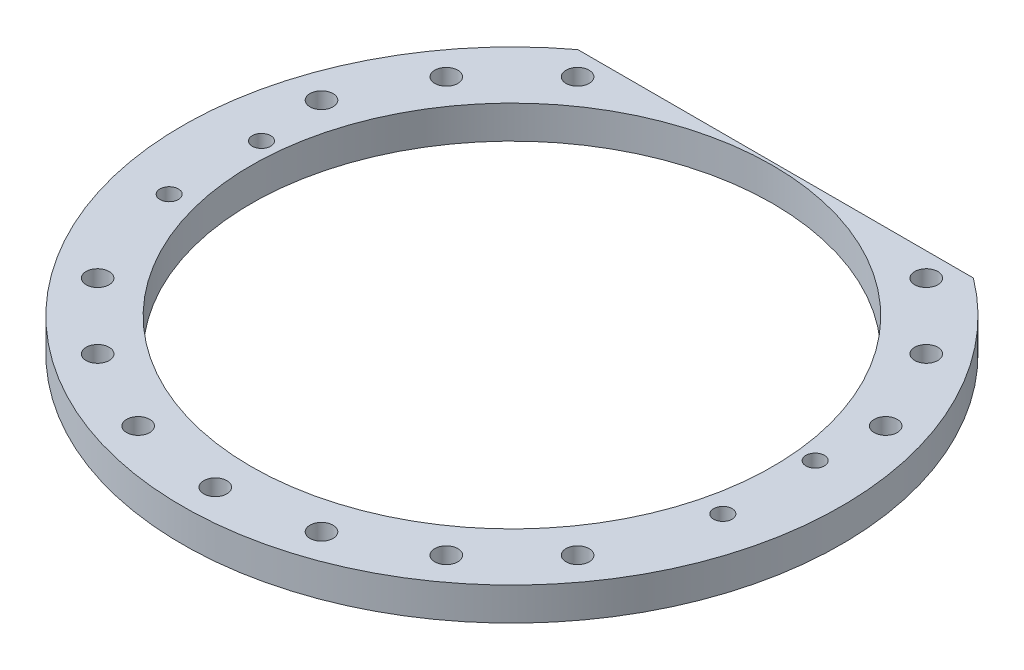
ISO-10303-21;
HEADER;
FILE_DESCRIPTION(('STEP AP214'),'2;1');
FILE_NAME('part.step','',(''),(''),'','','');
FILE_SCHEMA(('AUTOMOTIVE_DESIGN { 1 0 10303 214 1 1 1 1 }'));
ENDSEC;
DATA;
#1=APPLICATION_CONTEXT('core data for automotive mechanical design processes');
#2=APPLICATION_PROTOCOL_DEFINITION('international standard','automotive_design',2000,#1);
#3=PRODUCT_CONTEXT('',#1,'mechanical');
#4=PRODUCT('Part','Part','',(#3));
#5=PRODUCT_RELATED_PRODUCT_CATEGORY('part','',(#4));
#6=PRODUCT_DEFINITION_FORMATION('','',#4);
#7=PRODUCT_DEFINITION_CONTEXT('part definition',#1,'design');
#8=PRODUCT_DEFINITION('design','',#6,#7);
#9=PRODUCT_DEFINITION_SHAPE('','',#8);
#10=(LENGTH_UNIT() NAMED_UNIT(*) SI_UNIT(.MILLI.,.METRE.));
#11=(NAMED_UNIT(*) PLANE_ANGLE_UNIT() SI_UNIT($,.RADIAN.));
#12=(NAMED_UNIT(*) SI_UNIT($,.STERADIAN.) SOLID_ANGLE_UNIT());
#13=UNCERTAINTY_MEASURE_WITH_UNIT(LENGTH_MEASURE(1.E-05),#10,'distance_accuracy_value','');
#14=(GEOMETRIC_REPRESENTATION_CONTEXT(3) GLOBAL_UNCERTAINTY_ASSIGNED_CONTEXT((#13)) GLOBAL_UNIT_ASSIGNED_CONTEXT((#10,
#11,#12)) REPRESENTATION_CONTEXT('',''));
#15=CARTESIAN_POINT('',(0.,0.,0.));
#16=DIRECTION('',(0.,0.,1.));
#17=DIRECTION('',(1.,0.,0.));
#18=AXIS2_PLACEMENT_3D('',#15,#16,#17);
#19=CARTESIAN_POINT('',(0.,5.,0.));
#20=DIRECTION('',(0.,1.,0.));
#21=DIRECTION('',(0.,0.,1.));
#22=AXIS2_PLACEMENT_3D('',#19,#20,#21);
#23=PLANE('',#22);
#24=DIRECTION('',(1.,0.,0.));
#25=VECTOR('',#24,1.);
#26=CARTESIAN_POINT('',(0.,5.,-40.));
#27=LINE('',#26,#25);
#28=CARTESIAN_POINT('',(-30.,5.,-40.));
#29=VERTEX_POINT('',#28);
#30=CARTESIAN_POINT('',(30.,5.,-40.));
#31=VERTEX_POINT('',#30);
#32=EDGE_CURVE('E60',#29,#31,#27,.T.);
#33=ORIENTED_EDGE('',*,*,#32,.F.);
#34=CARTESIAN_POINT('',(0.,5.,0.));
#35=DIRECTION('',(0.,1.,0.));
#36=DIRECTION('',(0.,0.,1.));
#37=AXIS2_PLACEMENT_3D('',#34,#35,#36);
#38=CIRCLE('',#37,50.);
#39=EDGE_CURVE('E75',#29,#31,#38,.T.);
#40=ORIENTED_EDGE('',*,*,#39,.T.);
#41=EDGE_LOOP('',(#33,#40));
#42=FACE_BOUND('',#41,.T.);
#43=CARTESIAN_POINT('',(26.4503363531608,5.,36.405764746873));
#44=DIRECTION('',(0.,1.,0.));
#45=DIRECTION('',(0.,0.,1.));
#46=AXIS2_PLACEMENT_3D('',#43,#44,#45);
#47=CIRCLE('',#46,1.75);
#48=CARTESIAN_POINT('',(26.4503363531608,5.,38.155764746873));
#49=VERTEX_POINT('',#48);
#50=EDGE_CURVE('E213',#49,#49,#47,.T.);
#51=ORIENTED_EDGE('',*,*,#50,.F.);
#52=EDGE_LOOP('',(#51));
#53=FACE_BOUND('',#52,.T.);
#54=CARTESIAN_POINT('',(42.797543233282,5.,-13.9057647468722));
#55=DIRECTION('',(0.,1.,0.));
#56=DIRECTION('',(0.,0.,1.));
#57=AXIS2_PLACEMENT_3D('',#54,#55,#56);
#58=CIRCLE('',#57,1.74999999999999);
#59=CARTESIAN_POINT('',(42.797543233282,5.,-12.1557647468722));
#60=VERTEX_POINT('',#59);
#61=EDGE_CURVE('E197',#60,#60,#58,.T.);
#62=ORIENTED_EDGE('',*,*,#61,.F.);
#63=EDGE_LOOP('',(#62));
#64=FACE_BOUND('',#63,.T.);
#65=CARTESIAN_POINT('',(26.4503363531616,5.,-36.4057647468724));
#66=DIRECTION('',(0.,1.,0.));
#67=DIRECTION('',(0.,0.,1.));
#68=AXIS2_PLACEMENT_3D('',#65,#66,#67);
#69=CIRCLE('',#68,1.75);
#70=CARTESIAN_POINT('',(26.4503363531616,5.,-34.6557647468724));
#71=VERTEX_POINT('',#70);
#72=EDGE_CURVE('E181',#71,#71,#69,.T.);
#73=ORIENTED_EDGE('',*,*,#72,.F.);
#74=EDGE_LOOP('',(#73));
#75=FACE_BOUND('',#74,.T.);
#76=CARTESIAN_POINT('',(-36.4057647468725,5.,-26.4503363531615));
#77=DIRECTION('',(0.,1.,0.));
#78=DIRECTION('',(0.,0.,1.));
#79=AXIS2_PLACEMENT_3D('',#76,#77,#78);
#80=CIRCLE('',#79,1.75);
#81=CARTESIAN_POINT('',(-36.4057647468725,5.,-24.7003363531615));
#82=VERTEX_POINT('',#81);
#83=EDGE_CURVE('E165',#82,#82,#80,.T.);
#84=ORIENTED_EDGE('',*,*,#83,.F.);
#85=EDGE_LOOP('',(#84));
#86=FACE_BOUND('',#85,.T.);
#87=CARTESIAN_POINT('',(-36.4057647468727,5.,26.4503363531612));
#88=DIRECTION('',(0.,1.,0.));
#89=DIRECTION('',(0.,0.,1.));
#90=AXIS2_PLACEMENT_3D('',#87,#88,#89);
#91=CIRCLE('',#90,1.75);
#92=CARTESIAN_POINT('',(-36.4057647468727,5.,28.2003363531612));
#93=VERTEX_POINT('',#92);
#94=EDGE_CURVE('E149',#93,#93,#91,.T.);
#95=ORIENTED_EDGE('',*,*,#94,.F.);
#96=EDGE_LOOP('',(#95));
#97=FACE_BOUND('',#96,.T.);
#98=CARTESIAN_POINT('',(-13.9057647468727,5.,42.7975432332819));
#99=DIRECTION('',(0.,1.,0.));
#100=DIRECTION('',(0.,0.,1.));
#101=AXIS2_PLACEMENT_3D('',#98,#99,#100);
#102=CIRCLE('',#101,1.75);
#103=CARTESIAN_POINT('',(-13.9057647468727,5.,44.5475432332819));
#104=VERTEX_POINT('',#103);
#105=EDGE_CURVE('E133',#104,#104,#102,.T.);
#106=ORIENTED_EDGE('',*,*,#105,.F.);
#107=EDGE_LOOP('',(#106));
#108=FACE_BOUND('',#107,.T.);
#109=CARTESIAN_POINT('',(-42.,5.,-4.));
#110=DIRECTION('',(0.,1.,0.));
#111=DIRECTION('',(0.,0.,1.));
#112=AXIS2_PLACEMENT_3D('',#109,#110,#111);
#113=CIRCLE('',#112,1.4);
#114=CARTESIAN_POINT('',(-42.,5.,-2.6));
#115=VERTEX_POINT('',#114);
#116=EDGE_CURVE('E117',#115,#115,#113,.T.);
#117=ORIENTED_EDGE('',*,*,#116,.F.);
#118=EDGE_LOOP('',(#117));
#119=FACE_BOUND('',#118,.T.);
#120=CARTESIAN_POINT('',(42.,5.,-4.));
#121=DIRECTION('',(0.,1.,0.));
#122=DIRECTION('',(0.,0.,1.));
#123=AXIS2_PLACEMENT_3D('',#120,#121,#122);
#124=CIRCLE('',#123,1.4);
#125=CARTESIAN_POINT('',(42.,5.,-2.6));
#126=VERTEX_POINT('',#125);
#127=EDGE_CURVE('E101',#126,#126,#124,.T.);
#128=ORIENTED_EDGE('',*,*,#127,.F.);
#129=EDGE_LOOP('',(#128));
#130=FACE_BOUND('',#129,.T.);
#131=CARTESIAN_POINT('',(0.,5.,0.));
#132=DIRECTION('',(0.,1.,0.));
#133=DIRECTION('',(0.,0.,1.));
#134=AXIS2_PLACEMENT_3D('',#131,#132,#133);
#135=CIRCLE('',#134,39.565);
#136=CARTESIAN_POINT('',(0.,5.,39.565));
#137=VERTEX_POINT('',#136);
#138=EDGE_CURVE('E84',#137,#137,#135,.T.);
#139=ORIENTED_EDGE('',*,*,#138,.F.);
#140=EDGE_LOOP('',(#139));
#141=FACE_BOUND('',#140,.T.);
#142=CARTESIAN_POINT('',(42.,5.,10.));
#143=DIRECTION('',(0.,1.,0.));
#144=DIRECTION('',(0.,0.,1.));
#145=AXIS2_PLACEMENT_3D('',#142,#143,#144);
#146=CIRCLE('',#145,1.4);
#147=CARTESIAN_POINT('',(42.,5.,11.4));
#148=VERTEX_POINT('',#147);
#149=EDGE_CURVE('E95',#148,#148,#146,.T.);
#150=ORIENTED_EDGE('',*,*,#149,.F.);
#151=EDGE_LOOP('',(#150));
#152=FACE_BOUND('',#151,.T.);
#153=CARTESIAN_POINT('',(-42.,5.,10.));
#154=DIRECTION('',(0.,1.,0.));
#155=DIRECTION('',(0.,0.,1.));
#156=AXIS2_PLACEMENT_3D('',#153,#154,#155);
#157=CIRCLE('',#156,1.4);
#158=CARTESIAN_POINT('',(-42.,5.,11.4));
#159=VERTEX_POINT('',#158);
#160=EDGE_CURVE('E109',#159,#159,#157,.T.);
#161=ORIENTED_EDGE('',*,*,#160,.F.);
#162=EDGE_LOOP('',(#161));
#163=FACE_BOUND('',#162,.T.);
#164=CARTESIAN_POINT('',(0.,5.,45.));
#165=DIRECTION('',(0.,1.,0.));
#166=DIRECTION('',(0.,0.,1.));
#167=AXIS2_PLACEMENT_3D('',#164,#165,#166);
#168=CIRCLE('',#167,1.75);
#169=CARTESIAN_POINT('',(0.,5.,46.75));
#170=VERTEX_POINT('',#169);
#171=EDGE_CURVE('E125',#170,#170,#168,.T.);
#172=ORIENTED_EDGE('',*,*,#171,.F.);
#173=EDGE_LOOP('',(#172));
#174=FACE_BOUND('',#173,.T.);
#175=CARTESIAN_POINT('',(-26.4503363531613,5.,36.4057647468726));
#176=DIRECTION('',(0.,1.,0.));
#177=DIRECTION('',(0.,0.,1.));
#178=AXIS2_PLACEMENT_3D('',#175,#176,#177);
#179=CIRCLE('',#178,1.75);
#180=CARTESIAN_POINT('',(-26.4503363531613,5.,38.1557647468726));
#181=VERTEX_POINT('',#180);
#182=EDGE_CURVE('E141',#181,#181,#179,.T.);
#183=ORIENTED_EDGE('',*,*,#182,.F.);
#184=EDGE_LOOP('',(#183));
#185=FACE_BOUND('',#184,.T.);
#186=CARTESIAN_POINT('',(-42.7975432332819,5.,-13.9057647468728));
#187=DIRECTION('',(0.,1.,0.));
#188=DIRECTION('',(0.,0.,1.));
#189=AXIS2_PLACEMENT_3D('',#186,#187,#188);
#190=CIRCLE('',#189,1.75);
#191=CARTESIAN_POINT('',(-42.7975432332819,5.,-12.1557647468728));
#192=VERTEX_POINT('',#191);
#193=EDGE_CURVE('E157',#192,#192,#190,.T.);
#194=ORIENTED_EDGE('',*,*,#193,.F.);
#195=EDGE_LOOP('',(#194));
#196=FACE_BOUND('',#195,.T.);
#197=CARTESIAN_POINT('',(-26.4503363531611,5.,-36.4057647468728));
#198=DIRECTION('',(0.,1.,0.));
#199=DIRECTION('',(0.,0.,1.));
#200=AXIS2_PLACEMENT_3D('',#197,#198,#199);
#201=CIRCLE('',#200,1.75);
#202=CARTESIAN_POINT('',(-26.4503363531611,5.,-34.6557647468728));
#203=VERTEX_POINT('',#202);
#204=EDGE_CURVE('E173',#203,#203,#201,.T.);
#205=ORIENTED_EDGE('',*,*,#204,.F.);
#206=EDGE_LOOP('',(#205));
#207=FACE_BOUND('',#206,.T.);
#208=CARTESIAN_POINT('',(36.4057647468729,5.,-26.4503363531609));
#209=DIRECTION('',(0.,1.,0.));
#210=DIRECTION('',(0.,0.,1.));
#211=AXIS2_PLACEMENT_3D('',#208,#209,#210);
#212=CIRCLE('',#211,1.75);
#213=CARTESIAN_POINT('',(36.4057647468729,5.,-24.7003363531609));
#214=VERTEX_POINT('',#213);
#215=EDGE_CURVE('E189',#214,#214,#212,.T.);
#216=ORIENTED_EDGE('',*,*,#215,.F.);
#217=EDGE_LOOP('',(#216));
#218=FACE_BOUND('',#217,.T.);
#219=CARTESIAN_POINT('',(36.4057647468723,5.,26.4503363531617));
#220=DIRECTION('',(0.,1.,0.));
#221=DIRECTION('',(0.,0.,1.));
#222=AXIS2_PLACEMENT_3D('',#219,#220,#221);
#223=CIRCLE('',#222,1.75);
#224=CARTESIAN_POINT('',(36.4057647468723,5.,28.2003363531617));
#225=VERTEX_POINT('',#224);
#226=EDGE_CURVE('E205',#225,#225,#223,.T.);
#227=ORIENTED_EDGE('',*,*,#226,.F.);
#228=EDGE_LOOP('',(#227));
#229=FACE_BOUND('',#228,.T.);
#230=CARTESIAN_POINT('',(13.9057647468721,5.,42.7975432332821));
#231=DIRECTION('',(0.,1.,0.));
#232=DIRECTION('',(0.,0.,1.));
#233=AXIS2_PLACEMENT_3D('',#230,#231,#232);
#234=CIRCLE('',#233,1.75);
#235=CARTESIAN_POINT('',(13.9057647468721,5.,44.5475432332821));
#236=VERTEX_POINT('',#235);
#237=EDGE_CURVE('E221',#236,#236,#234,.T.);
#238=ORIENTED_EDGE('',*,*,#237,.F.);
#239=EDGE_LOOP('',(#238));
#240=FACE_BOUND('',#239,.T.);
#241=ADVANCED_FACE('F44',(#42,#53,#64,#75,#86,#97,#108,#119,#130,#141,#152,#163,#174,#185,#196,
#207,#218,#229,#240),#23,.T.);
#242=CARTESIAN_POINT('',(0.,0.,0.));
#243=DIRECTION('',(0.,1.,0.));
#244=DIRECTION('',(0.,0.,1.));
#245=AXIS2_PLACEMENT_3D('',#242,#243,#244);
#246=PLANE('',#245);
#247=CARTESIAN_POINT('',(0.,0.,0.));
#248=DIRECTION('',(0.,1.,0.));
#249=DIRECTION('',(0.,0.,1.));
#250=AXIS2_PLACEMENT_3D('',#247,#248,#249);
#251=CIRCLE('',#250,50.);
#252=CARTESIAN_POINT('',(-30.,0.,-40.));
#253=VERTEX_POINT('',#252);
#254=CARTESIAN_POINT('',(30.,0.,-40.));
#255=VERTEX_POINT('',#254);
#256=EDGE_CURVE('E80',#253,#255,#251,.T.);
#257=ORIENTED_EDGE('',*,*,#256,.F.);
#258=DIRECTION('',(1.,0.,0.));
#259=VECTOR('',#258,1.);
#260=CARTESIAN_POINT('',(0.,0.,-40.));
#261=LINE('',#260,#259);
#262=EDGE_CURVE('E69',#253,#255,#261,.T.);
#263=ORIENTED_EDGE('',*,*,#262,.T.);
#264=EDGE_LOOP('',(#257,#263));
#265=FACE_BOUND('',#264,.T.);
#266=CARTESIAN_POINT('',(0.,0.,0.));
#267=DIRECTION('',(0.,1.,0.));
#268=DIRECTION('',(0.,0.,1.));
#269=AXIS2_PLACEMENT_3D('',#266,#267,#268);
#270=CIRCLE('',#269,39.565);
#271=CARTESIAN_POINT('',(0.,0.,39.565));
#272=VERTEX_POINT('',#271);
#273=EDGE_CURVE('E90',#272,#272,#270,.T.);
#274=ORIENTED_EDGE('',*,*,#273,.T.);
#275=EDGE_LOOP('',(#274));
#276=FACE_BOUND('',#275,.T.);
#277=CARTESIAN_POINT('',(42.,0.,10.));
#278=DIRECTION('',(0.,1.,0.));
#279=DIRECTION('',(0.,0.,1.));
#280=AXIS2_PLACEMENT_3D('',#277,#278,#279);
#281=CIRCLE('',#280,1.4);
#282=CARTESIAN_POINT('',(42.,0.,11.4));
#283=VERTEX_POINT('',#282);
#284=EDGE_CURVE('E97',#283,#283,#281,.T.);
#285=ORIENTED_EDGE('',*,*,#284,.T.);
#286=EDGE_LOOP('',(#285));
#287=FACE_BOUND('',#286,.T.);
#288=CARTESIAN_POINT('',(42.,0.,-4.));
#289=DIRECTION('',(0.,1.,0.));
#290=DIRECTION('',(0.,0.,1.));
#291=AXIS2_PLACEMENT_3D('',#288,#289,#290);
#292=CIRCLE('',#291,1.4);
#293=CARTESIAN_POINT('',(42.,0.,-2.6));
#294=VERTEX_POINT('',#293);
#295=EDGE_CURVE('E105',#294,#294,#292,.T.);
#296=ORIENTED_EDGE('',*,*,#295,.T.);
#297=EDGE_LOOP('',(#296));
#298=FACE_BOUND('',#297,.T.);
#299=CARTESIAN_POINT('',(-42.,0.,10.));
#300=DIRECTION('',(0.,1.,0.));
#301=DIRECTION('',(0.,0.,1.));
#302=AXIS2_PLACEMENT_3D('',#299,#300,#301);
#303=CIRCLE('',#302,1.4);
#304=CARTESIAN_POINT('',(-42.,0.,11.4));
#305=VERTEX_POINT('',#304);
#306=EDGE_CURVE('E113',#305,#305,#303,.T.);
#307=ORIENTED_EDGE('',*,*,#306,.T.);
#308=EDGE_LOOP('',(#307));
#309=FACE_BOUND('',#308,.T.);
#310=CARTESIAN_POINT('',(-42.,0.,-4.));
#311=DIRECTION('',(0.,1.,0.));
#312=DIRECTION('',(0.,0.,1.));
#313=AXIS2_PLACEMENT_3D('',#310,#311,#312);
#314=CIRCLE('',#313,1.4);
#315=CARTESIAN_POINT('',(-42.,0.,-2.6));
#316=VERTEX_POINT('',#315);
#317=EDGE_CURVE('E121',#316,#316,#314,.T.);
#318=ORIENTED_EDGE('',*,*,#317,.T.);
#319=EDGE_LOOP('',(#318));
#320=FACE_BOUND('',#319,.T.);
#321=CARTESIAN_POINT('',(0.,0.,45.));
#322=DIRECTION('',(0.,1.,0.));
#323=DIRECTION('',(0.,0.,1.));
#324=AXIS2_PLACEMENT_3D('',#321,#322,#323);
#325=CIRCLE('',#324,1.75);
#326=CARTESIAN_POINT('',(0.,0.,46.75));
#327=VERTEX_POINT('',#326);
#328=EDGE_CURVE('E129',#327,#327,#325,.T.);
#329=ORIENTED_EDGE('',*,*,#328,.T.);
#330=EDGE_LOOP('',(#329));
#331=FACE_BOUND('',#330,.T.);
#332=CARTESIAN_POINT('',(-13.9057647468727,0.,42.7975432332819));
#333=DIRECTION('',(0.,1.,0.));
#334=DIRECTION('',(0.,0.,1.));
#335=AXIS2_PLACEMENT_3D('',#332,#333,#334);
#336=CIRCLE('',#335,1.75);
#337=CARTESIAN_POINT('',(-13.9057647468727,0.,44.5475432332819));
#338=VERTEX_POINT('',#337);
#339=EDGE_CURVE('E137',#338,#338,#336,.T.);
#340=ORIENTED_EDGE('',*,*,#339,.T.);
#341=EDGE_LOOP('',(#340));
#342=FACE_BOUND('',#341,.T.);
#343=CARTESIAN_POINT('',(-26.4503363531613,0.,36.4057647468726));
#344=DIRECTION('',(0.,1.,0.));
#345=DIRECTION('',(0.,0.,1.));
#346=AXIS2_PLACEMENT_3D('',#343,#344,#345);
#347=CIRCLE('',#346,1.75);
#348=CARTESIAN_POINT('',(-26.4503363531613,0.,38.1557647468726));
#349=VERTEX_POINT('',#348);
#350=EDGE_CURVE('E145',#349,#349,#347,.T.);
#351=ORIENTED_EDGE('',*,*,#350,.T.);
#352=EDGE_LOOP('',(#351));
#353=FACE_BOUND('',#352,.T.);
#354=CARTESIAN_POINT('',(-36.4057647468727,0.,26.4503363531612));
#355=DIRECTION('',(0.,1.,0.));
#356=DIRECTION('',(0.,0.,1.));
#357=AXIS2_PLACEMENT_3D('',#354,#355,#356);
#358=CIRCLE('',#357,1.75);
#359=CARTESIAN_POINT('',(-36.4057647468727,0.,28.2003363531612));
#360=VERTEX_POINT('',#359);
#361=EDGE_CURVE('E153',#360,#360,#358,.T.);
#362=ORIENTED_EDGE('',*,*,#361,.T.);
#363=EDGE_LOOP('',(#362));
#364=FACE_BOUND('',#363,.T.);
#365=CARTESIAN_POINT('',(-42.7975432332819,0.,-13.9057647468728));
#366=DIRECTION('',(0.,1.,0.));
#367=DIRECTION('',(0.,0.,1.));
#368=AXIS2_PLACEMENT_3D('',#365,#366,#367);
#369=CIRCLE('',#368,1.75);
#370=CARTESIAN_POINT('',(-42.7975432332819,0.,-12.1557647468728));
#371=VERTEX_POINT('',#370);
#372=EDGE_CURVE('E161',#371,#371,#369,.T.);
#373=ORIENTED_EDGE('',*,*,#372,.T.);
#374=EDGE_LOOP('',(#373));
#375=FACE_BOUND('',#374,.T.);
#376=CARTESIAN_POINT('',(-36.4057647468725,0.,-26.4503363531615));
#377=DIRECTION('',(0.,1.,0.));
#378=DIRECTION('',(0.,0.,1.));
#379=AXIS2_PLACEMENT_3D('',#376,#377,#378);
#380=CIRCLE('',#379,1.75);
#381=CARTESIAN_POINT('',(-36.4057647468725,0.,-24.7003363531615));
#382=VERTEX_POINT('',#381);
#383=EDGE_CURVE('E169',#382,#382,#380,.T.);
#384=ORIENTED_EDGE('',*,*,#383,.T.);
#385=EDGE_LOOP('',(#384));
#386=FACE_BOUND('',#385,.T.);
#387=CARTESIAN_POINT('',(-26.4503363531611,0.,-36.4057647468728));
#388=DIRECTION('',(0.,1.,0.));
#389=DIRECTION('',(0.,0.,1.));
#390=AXIS2_PLACEMENT_3D('',#387,#388,#389);
#391=CIRCLE('',#390,1.75);
#392=CARTESIAN_POINT('',(-26.4503363531611,0.,-34.6557647468728));
#393=VERTEX_POINT('',#392);
#394=EDGE_CURVE('E177',#393,#393,#391,.T.);
#395=ORIENTED_EDGE('',*,*,#394,.T.);
#396=EDGE_LOOP('',(#395));
#397=FACE_BOUND('',#396,.T.);
#398=CARTESIAN_POINT('',(26.4503363531616,0.,-36.4057647468724));
#399=DIRECTION('',(0.,1.,0.));
#400=DIRECTION('',(0.,0.,1.));
#401=AXIS2_PLACEMENT_3D('',#398,#399,#400);
#402=CIRCLE('',#401,1.75);
#403=CARTESIAN_POINT('',(26.4503363531616,0.,-34.6557647468724));
#404=VERTEX_POINT('',#403);
#405=EDGE_CURVE('E185',#404,#404,#402,.T.);
#406=ORIENTED_EDGE('',*,*,#405,.T.);
#407=EDGE_LOOP('',(#406));
#408=FACE_BOUND('',#407,.T.);
#409=CARTESIAN_POINT('',(36.4057647468729,0.,-26.4503363531609));
#410=DIRECTION('',(0.,1.,0.));
#411=DIRECTION('',(0.,0.,1.));
#412=AXIS2_PLACEMENT_3D('',#409,#410,#411);
#413=CIRCLE('',#412,1.75);
#414=CARTESIAN_POINT('',(36.4057647468729,0.,-24.7003363531609));
#415=VERTEX_POINT('',#414);
#416=EDGE_CURVE('E193',#415,#415,#413,.T.);
#417=ORIENTED_EDGE('',*,*,#416,.T.);
#418=EDGE_LOOP('',(#417));
#419=FACE_BOUND('',#418,.T.);
#420=CARTESIAN_POINT('',(42.797543233282,0.,-13.9057647468722));
#421=DIRECTION('',(0.,1.,0.));
#422=DIRECTION('',(0.,0.,1.));
#423=AXIS2_PLACEMENT_3D('',#420,#421,#422);
#424=CIRCLE('',#423,1.74999999999999);
#425=CARTESIAN_POINT('',(42.797543233282,0.,-12.1557647468722));
#426=VERTEX_POINT('',#425);
#427=EDGE_CURVE('E201',#426,#426,#424,.T.);
#428=ORIENTED_EDGE('',*,*,#427,.T.);
#429=EDGE_LOOP('',(#428));
#430=FACE_BOUND('',#429,.T.);
#431=CARTESIAN_POINT('',(36.4057647468723,0.,26.4503363531617));
#432=DIRECTION('',(0.,1.,0.));
#433=DIRECTION('',(0.,0.,1.));
#434=AXIS2_PLACEMENT_3D('',#431,#432,#433);
#435=CIRCLE('',#434,1.75);
#436=CARTESIAN_POINT('',(36.4057647468723,0.,28.2003363531617));
#437=VERTEX_POINT('',#436);
#438=EDGE_CURVE('E209',#437,#437,#435,.T.);
#439=ORIENTED_EDGE('',*,*,#438,.T.);
#440=EDGE_LOOP('',(#439));
#441=FACE_BOUND('',#440,.T.);
#442=CARTESIAN_POINT('',(26.4503363531608,0.,36.405764746873));
#443=DIRECTION('',(0.,1.,0.));
#444=DIRECTION('',(0.,0.,1.));
#445=AXIS2_PLACEMENT_3D('',#442,#443,#444);
#446=CIRCLE('',#445,1.75);
#447=CARTESIAN_POINT('',(26.4503363531608,0.,38.155764746873));
#448=VERTEX_POINT('',#447);
#449=EDGE_CURVE('E217',#448,#448,#446,.T.);
#450=ORIENTED_EDGE('',*,*,#449,.T.);
#451=EDGE_LOOP('',(#450));
#452=FACE_BOUND('',#451,.T.);
#453=CARTESIAN_POINT('',(13.9057647468721,0.,42.7975432332821));
#454=DIRECTION('',(0.,1.,0.));
#455=DIRECTION('',(0.,0.,1.));
#456=AXIS2_PLACEMENT_3D('',#453,#454,#455);
#457=CIRCLE('',#456,1.75);
#458=CARTESIAN_POINT('',(13.9057647468721,0.,44.5475432332821));
#459=VERTEX_POINT('',#458);
#460=EDGE_CURVE('E225',#459,#459,#457,.T.);
#461=ORIENTED_EDGE('',*,*,#460,.T.);
#462=EDGE_LOOP('',(#461));
#463=FACE_BOUND('',#462,.T.);
#464=ADVANCED_FACE('F78',(#265,#276,#287,#298,#309,#320,#331,#342,#353,#364,#375,#386,#397,#408,
#419,#430,#441,#452,#463),#246,.F.);
#465=CARTESIAN_POINT('',(0.,5.,0.));
#466=DIRECTION('',(0.,-1.,0.));
#467=DIRECTION('',(0.,0.,-1.));
#468=AXIS2_PLACEMENT_3D('',#465,#466,#467);
#469=CYLINDRICAL_SURFACE('',#468,50.);
#470=ORIENTED_EDGE('',*,*,#39,.F.);
#471=DIRECTION('',(0.,-1.,0.));
#472=VECTOR('',#471,1.);
#473=CARTESIAN_POINT('',(-30.,5.,-40.));
#474=LINE('',#473,#472);
#475=EDGE_CURVE('E11',#29,#253,#474,.T.);
#476=ORIENTED_EDGE('',*,*,#475,.T.);
#477=ORIENTED_EDGE('',*,*,#256,.T.);
#478=DIRECTION('',(0.,-1.,0.));
#479=VECTOR('',#478,1.);
#480=CARTESIAN_POINT('',(30.,5.,-40.));
#481=LINE('',#480,#479);
#482=EDGE_CURVE('E53',#255,#31,#481,.F.);
#483=ORIENTED_EDGE('',*,*,#482,.T.);
#484=EDGE_LOOP('',(#470,#476,#477,#483));
#485=FACE_BOUND('',#484,.T.);
#486=ADVANCED_FACE('F46',(#485),#469,.T.);
#487=CARTESIAN_POINT('',(0.,5.,0.));
#488=DIRECTION('',(0.,-1.,0.));
#489=DIRECTION('',(0.,0.,-1.));
#490=AXIS2_PLACEMENT_3D('',#487,#488,#489);
#491=CYLINDRICAL_SURFACE('',#490,39.565);
#492=ORIENTED_EDGE('',*,*,#138,.T.);
#493=EDGE_LOOP('',(#492));
#494=FACE_BOUND('',#493,.T.);
#495=ORIENTED_EDGE('',*,*,#273,.F.);
#496=EDGE_LOOP('',(#495));
#497=FACE_BOUND('',#496,.T.);
#498=ADVANCED_FACE('F247',(#494,#497),#491,.F.);
#499=CARTESIAN_POINT('',(42.,5.,10.));
#500=DIRECTION('',(0.,-1.,0.));
#501=DIRECTION('',(0.,0.,-1.));
#502=AXIS2_PLACEMENT_3D('',#499,#500,#501);
#503=CYLINDRICAL_SURFACE('',#502,1.4);
#504=ORIENTED_EDGE('',*,*,#149,.T.);
#505=EDGE_LOOP('',(#504));
#506=FACE_BOUND('',#505,.T.);
#507=ORIENTED_EDGE('',*,*,#284,.F.);
#508=EDGE_LOOP('',(#507));
#509=FACE_BOUND('',#508,.T.);
#510=ADVANCED_FACE('F250',(#506,#509),#503,.F.);
#511=CARTESIAN_POINT('',(42.,5.,-4.));
#512=DIRECTION('',(0.,-1.,0.));
#513=DIRECTION('',(0.,0.,-1.));
#514=AXIS2_PLACEMENT_3D('',#511,#512,#513);
#515=CYLINDRICAL_SURFACE('',#514,1.4);
#516=ORIENTED_EDGE('',*,*,#127,.T.);
#517=EDGE_LOOP('',(#516));
#518=FACE_BOUND('',#517,.T.);
#519=ORIENTED_EDGE('',*,*,#295,.F.);
#520=EDGE_LOOP('',(#519));
#521=FACE_BOUND('',#520,.T.);
#522=ADVANCED_FACE('F254',(#518,#521),#515,.F.);
#523=CARTESIAN_POINT('',(-42.,5.,10.));
#524=DIRECTION('',(0.,-1.,0.));
#525=DIRECTION('',(0.,0.,-1.));
#526=AXIS2_PLACEMENT_3D('',#523,#524,#525);
#527=CYLINDRICAL_SURFACE('',#526,1.4);
#528=ORIENTED_EDGE('',*,*,#160,.T.);
#529=EDGE_LOOP('',(#528));
#530=FACE_BOUND('',#529,.T.);
#531=ORIENTED_EDGE('',*,*,#306,.F.);
#532=EDGE_LOOP('',(#531));
#533=FACE_BOUND('',#532,.T.);
#534=ADVANCED_FACE('F258',(#530,#533),#527,.F.);
#535=CARTESIAN_POINT('',(-42.,5.,-4.));
#536=DIRECTION('',(0.,-1.,0.));
#537=DIRECTION('',(0.,0.,-1.));
#538=AXIS2_PLACEMENT_3D('',#535,#536,#537);
#539=CYLINDRICAL_SURFACE('',#538,1.4);
#540=ORIENTED_EDGE('',*,*,#116,.T.);
#541=EDGE_LOOP('',(#540));
#542=FACE_BOUND('',#541,.T.);
#543=ORIENTED_EDGE('',*,*,#317,.F.);
#544=EDGE_LOOP('',(#543));
#545=FACE_BOUND('',#544,.T.);
#546=ADVANCED_FACE('F262',(#542,#545),#539,.F.);
#547=CARTESIAN_POINT('',(0.,5.,45.));
#548=DIRECTION('',(0.,-1.,0.));
#549=DIRECTION('',(0.,0.,-1.));
#550=AXIS2_PLACEMENT_3D('',#547,#548,#549);
#551=CYLINDRICAL_SURFACE('',#550,1.75);
#552=ORIENTED_EDGE('',*,*,#171,.T.);
#553=EDGE_LOOP('',(#552));
#554=FACE_BOUND('',#553,.T.);
#555=ORIENTED_EDGE('',*,*,#328,.F.);
#556=EDGE_LOOP('',(#555));
#557=FACE_BOUND('',#556,.T.);
#558=ADVANCED_FACE('F266',(#554,#557),#551,.F.);
#559=CARTESIAN_POINT('',(-13.9057647468727,5.,42.7975432332819));
#560=DIRECTION('',(0.,-1.,0.));
#561=DIRECTION('',(0.,0.,-1.));
#562=AXIS2_PLACEMENT_3D('',#559,#560,#561);
#563=CYLINDRICAL_SURFACE('',#562,1.75);
#564=ORIENTED_EDGE('',*,*,#105,.T.);
#565=EDGE_LOOP('',(#564));
#566=FACE_BOUND('',#565,.T.);
#567=ORIENTED_EDGE('',*,*,#339,.F.);
#568=EDGE_LOOP('',(#567));
#569=FACE_BOUND('',#568,.T.);
#570=ADVANCED_FACE('F270',(#566,#569),#563,.F.);
#571=CARTESIAN_POINT('',(-26.4503363531613,5.,36.4057647468726));
#572=DIRECTION('',(0.,-1.,0.));
#573=DIRECTION('',(0.,0.,-1.));
#574=AXIS2_PLACEMENT_3D('',#571,#572,#573);
#575=CYLINDRICAL_SURFACE('',#574,1.75);
#576=ORIENTED_EDGE('',*,*,#182,.T.);
#577=EDGE_LOOP('',(#576));
#578=FACE_BOUND('',#577,.T.);
#579=ORIENTED_EDGE('',*,*,#350,.F.);
#580=EDGE_LOOP('',(#579));
#581=FACE_BOUND('',#580,.T.);
#582=ADVANCED_FACE('F274',(#578,#581),#575,.F.);
#583=CARTESIAN_POINT('',(-36.4057647468727,5.,26.4503363531612));
#584=DIRECTION('',(0.,-1.,0.));
#585=DIRECTION('',(0.,0.,-1.));
#586=AXIS2_PLACEMENT_3D('',#583,#584,#585);
#587=CYLINDRICAL_SURFACE('',#586,1.75);
#588=ORIENTED_EDGE('',*,*,#94,.T.);
#589=EDGE_LOOP('',(#588));
#590=FACE_BOUND('',#589,.T.);
#591=ORIENTED_EDGE('',*,*,#361,.F.);
#592=EDGE_LOOP('',(#591));
#593=FACE_BOUND('',#592,.T.);
#594=ADVANCED_FACE('F278',(#590,#593),#587,.F.);
#595=CARTESIAN_POINT('',(-42.7975432332819,5.,-13.9057647468728));
#596=DIRECTION('',(0.,-1.,0.));
#597=DIRECTION('',(0.,0.,-1.));
#598=AXIS2_PLACEMENT_3D('',#595,#596,#597);
#599=CYLINDRICAL_SURFACE('',#598,1.75);
#600=ORIENTED_EDGE('',*,*,#193,.T.);
#601=EDGE_LOOP('',(#600));
#602=FACE_BOUND('',#601,.T.);
#603=ORIENTED_EDGE('',*,*,#372,.F.);
#604=EDGE_LOOP('',(#603));
#605=FACE_BOUND('',#604,.T.);
#606=ADVANCED_FACE('F282',(#602,#605),#599,.F.);
#607=CARTESIAN_POINT('',(-36.4057647468725,5.,-26.4503363531615));
#608=DIRECTION('',(0.,-1.,0.));
#609=DIRECTION('',(0.,0.,-1.));
#610=AXIS2_PLACEMENT_3D('',#607,#608,#609);
#611=CYLINDRICAL_SURFACE('',#610,1.75);
#612=ORIENTED_EDGE('',*,*,#83,.T.);
#613=EDGE_LOOP('',(#612));
#614=FACE_BOUND('',#613,.T.);
#615=ORIENTED_EDGE('',*,*,#383,.F.);
#616=EDGE_LOOP('',(#615));
#617=FACE_BOUND('',#616,.T.);
#618=ADVANCED_FACE('F286',(#614,#617),#611,.F.);
#619=CARTESIAN_POINT('',(-26.4503363531611,5.,-36.4057647468728));
#620=DIRECTION('',(0.,-1.,0.));
#621=DIRECTION('',(0.,0.,-1.));
#622=AXIS2_PLACEMENT_3D('',#619,#620,#621);
#623=CYLINDRICAL_SURFACE('',#622,1.75);
#624=ORIENTED_EDGE('',*,*,#204,.T.);
#625=EDGE_LOOP('',(#624));
#626=FACE_BOUND('',#625,.T.);
#627=ORIENTED_EDGE('',*,*,#394,.F.);
#628=EDGE_LOOP('',(#627));
#629=FACE_BOUND('',#628,.T.);
#630=ADVANCED_FACE('F290',(#626,#629),#623,.F.);
#631=CARTESIAN_POINT('',(26.4503363531616,5.,-36.4057647468724));
#632=DIRECTION('',(0.,-1.,0.));
#633=DIRECTION('',(0.,0.,-1.));
#634=AXIS2_PLACEMENT_3D('',#631,#632,#633);
#635=CYLINDRICAL_SURFACE('',#634,1.75);
#636=ORIENTED_EDGE('',*,*,#72,.T.);
#637=EDGE_LOOP('',(#636));
#638=FACE_BOUND('',#637,.T.);
#639=ORIENTED_EDGE('',*,*,#405,.F.);
#640=EDGE_LOOP('',(#639));
#641=FACE_BOUND('',#640,.T.);
#642=ADVANCED_FACE('F294',(#638,#641),#635,.F.);
#643=CARTESIAN_POINT('',(36.4057647468729,5.,-26.4503363531609));
#644=DIRECTION('',(0.,-1.,0.));
#645=DIRECTION('',(0.,0.,-1.));
#646=AXIS2_PLACEMENT_3D('',#643,#644,#645);
#647=CYLINDRICAL_SURFACE('',#646,1.75);
#648=ORIENTED_EDGE('',*,*,#215,.T.);
#649=EDGE_LOOP('',(#648));
#650=FACE_BOUND('',#649,.T.);
#651=ORIENTED_EDGE('',*,*,#416,.F.);
#652=EDGE_LOOP('',(#651));
#653=FACE_BOUND('',#652,.T.);
#654=ADVANCED_FACE('F298',(#650,#653),#647,.F.);
#655=CARTESIAN_POINT('',(42.797543233282,5.,-13.9057647468722));
#656=DIRECTION('',(0.,-1.,0.));
#657=DIRECTION('',(0.,0.,-1.));
#658=AXIS2_PLACEMENT_3D('',#655,#656,#657);
#659=CYLINDRICAL_SURFACE('',#658,1.74999999999999);
#660=ORIENTED_EDGE('',*,*,#61,.T.);
#661=EDGE_LOOP('',(#660));
#662=FACE_BOUND('',#661,.T.);
#663=ORIENTED_EDGE('',*,*,#427,.F.);
#664=EDGE_LOOP('',(#663));
#665=FACE_BOUND('',#664,.T.);
#666=ADVANCED_FACE('F302',(#662,#665),#659,.F.);
#667=CARTESIAN_POINT('',(36.4057647468723,5.,26.4503363531617));
#668=DIRECTION('',(0.,-1.,0.));
#669=DIRECTION('',(0.,0.,-1.));
#670=AXIS2_PLACEMENT_3D('',#667,#668,#669);
#671=CYLINDRICAL_SURFACE('',#670,1.75);
#672=ORIENTED_EDGE('',*,*,#226,.T.);
#673=EDGE_LOOP('',(#672));
#674=FACE_BOUND('',#673,.T.);
#675=ORIENTED_EDGE('',*,*,#438,.F.);
#676=EDGE_LOOP('',(#675));
#677=FACE_BOUND('',#676,.T.);
#678=ADVANCED_FACE('F306',(#674,#677),#671,.F.);
#679=CARTESIAN_POINT('',(26.4503363531608,5.,36.405764746873));
#680=DIRECTION('',(0.,-1.,0.));
#681=DIRECTION('',(0.,0.,-1.));
#682=AXIS2_PLACEMENT_3D('',#679,#680,#681);
#683=CYLINDRICAL_SURFACE('',#682,1.75);
#684=ORIENTED_EDGE('',*,*,#50,.T.);
#685=EDGE_LOOP('',(#684));
#686=FACE_BOUND('',#685,.T.);
#687=ORIENTED_EDGE('',*,*,#449,.F.);
#688=EDGE_LOOP('',(#687));
#689=FACE_BOUND('',#688,.T.);
#690=ADVANCED_FACE('F310',(#686,#689),#683,.F.);
#691=CARTESIAN_POINT('',(13.9057647468721,5.,42.7975432332821));
#692=DIRECTION('',(0.,-1.,0.));
#693=DIRECTION('',(0.,0.,-1.));
#694=AXIS2_PLACEMENT_3D('',#691,#692,#693);
#695=CYLINDRICAL_SURFACE('',#694,1.75);
#696=ORIENTED_EDGE('',*,*,#237,.T.);
#697=EDGE_LOOP('',(#696));
#698=FACE_BOUND('',#697,.T.);
#699=ORIENTED_EDGE('',*,*,#460,.F.);
#700=EDGE_LOOP('',(#699));
#701=FACE_BOUND('',#700,.T.);
#702=ADVANCED_FACE('F235',(#698,#701),#695,.F.);
#703=CARTESIAN_POINT('',(0.,0.,-40.));
#704=DIRECTION('',(0.,0.,1.));
#705=DIRECTION('',(1.,0.,0.));
#706=AXIS2_PLACEMENT_3D('',#703,#704,#705);
#707=PLANE('',#706);
#708=ORIENTED_EDGE('',*,*,#32,.T.);
#709=ORIENTED_EDGE('',*,*,#482,.F.);
#710=ORIENTED_EDGE('',*,*,#262,.F.);
#711=ORIENTED_EDGE('',*,*,#475,.F.);
#712=EDGE_LOOP('',(#708,#709,#710,#711));
#713=FACE_BOUND('',#712,.T.);
#714=ADVANCED_FACE('F68',(#713),#707,.F.);
#715=CLOSED_SHELL('',(#241,#464,#486,#498,#510,#522,#534,#546,#558,#570,#582,#594,#606,#618,
#630,#642,#654,#666,#678,#690,#702,#714));
#716=MANIFOLD_SOLID_BREP('B2',#715);
#717=ADVANCED_BREP_SHAPE_REPRESENTATION('',(#18,#716),#14);
#718=SHAPE_DEFINITION_REPRESENTATION(#9,#717);
ENDSEC;
END-ISO-10303-21;
